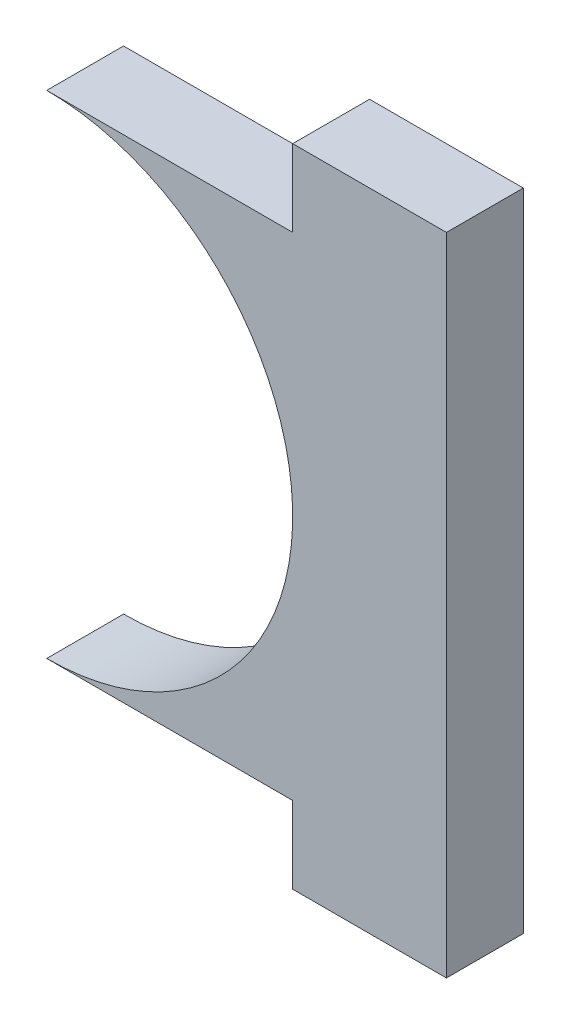
ISO-10303-21;
HEADER;
FILE_DESCRIPTION(('STEP AP214'),'2;1');
FILE_NAME('part.step','',(''),(''),'','','');
FILE_SCHEMA(('AUTOMOTIVE_DESIGN { 1 0 10303 214 1 1 1 1 }'));
ENDSEC;
DATA;
#1=APPLICATION_CONTEXT('core data for automotive mechanical design processes');
#2=APPLICATION_PROTOCOL_DEFINITION('international standard','automotive_design',2000,#1);
#3=PRODUCT_CONTEXT('',#1,'mechanical');
#4=PRODUCT('Part','Part','',(#3));
#5=PRODUCT_RELATED_PRODUCT_CATEGORY('part','',(#4));
#6=PRODUCT_DEFINITION_FORMATION('','',#4);
#7=PRODUCT_DEFINITION_CONTEXT('part definition',#1,'design');
#8=PRODUCT_DEFINITION('design','',#6,#7);
#9=PRODUCT_DEFINITION_SHAPE('','',#8);
#10=(LENGTH_UNIT() NAMED_UNIT(*) SI_UNIT(.MILLI.,.METRE.));
#11=(NAMED_UNIT(*) PLANE_ANGLE_UNIT() SI_UNIT($,.RADIAN.));
#12=(NAMED_UNIT(*) SI_UNIT($,.STERADIAN.) SOLID_ANGLE_UNIT());
#13=UNCERTAINTY_MEASURE_WITH_UNIT(LENGTH_MEASURE(1.E-05),#10,'distance_accuracy_value','');
#14=(GEOMETRIC_REPRESENTATION_CONTEXT(3) GLOBAL_UNCERTAINTY_ASSIGNED_CONTEXT((#13)) GLOBAL_UNIT_ASSIGNED_CONTEXT((#10,
#11,#12)) REPRESENTATION_CONTEXT('',''));
#15=CARTESIAN_POINT('',(0.,0.,0.));
#16=DIRECTION('',(0.,0.,1.));
#17=DIRECTION('',(1.,0.,0.));
#18=AXIS2_PLACEMENT_3D('',#15,#16,#17);
#19=CARTESIAN_POINT('',(26.,-21.,2.5));
#20=DIRECTION('',(0.,1.,0.));
#21=DIRECTION('',(0.,0.,1.));
#22=AXIS2_PLACEMENT_3D('',#19,#20,#21);
#23=PLANE('',#22);
#24=DIRECTION('',(1.,0.,0.));
#25=VECTOR('',#24,1.);
#26=CARTESIAN_POINT('',(26.,-21.,-2.5));
#27=LINE('',#26,#25);
#28=CARTESIAN_POINT('',(16.,-21.,-2.5));
#29=VERTEX_POINT('',#28);
#30=CARTESIAN_POINT('',(26.,-21.,-2.5));
#31=VERTEX_POINT('',#30);
#32=EDGE_CURVE('E135',#29,#31,#27,.T.);
#33=ORIENTED_EDGE('',*,*,#32,.T.);
#34=DIRECTION('',(0.,0.,-1.));
#35=VECTOR('',#34,1.);
#36=CARTESIAN_POINT('',(26.,-21.,2.5));
#37=LINE('',#36,#35);
#38=CARTESIAN_POINT('',(26.,-21.,2.5));
#39=VERTEX_POINT('',#38);
#40=EDGE_CURVE('E11',#39,#31,#37,.T.);
#41=ORIENTED_EDGE('',*,*,#40,.F.);
#42=DIRECTION('',(1.,0.,0.));
#43=VECTOR('',#42,1.);
#44=CARTESIAN_POINT('',(26.,-21.,2.5));
#45=LINE('',#44,#43);
#46=CARTESIAN_POINT('',(16.,-21.,2.5));
#47=VERTEX_POINT('',#46);
#48=EDGE_CURVE('E149',#47,#39,#45,.T.);
#49=ORIENTED_EDGE('',*,*,#48,.F.);
#50=DIRECTION('',(0.,0.,-1.));
#51=VECTOR('',#50,1.);
#52=CARTESIAN_POINT('',(16.,-21.,2.5));
#53=LINE('',#52,#51);
#54=EDGE_CURVE('E131',#47,#29,#53,.T.);
#55=ORIENTED_EDGE('',*,*,#54,.T.);
#56=EDGE_LOOP('',(#33,#41,#49,#55));
#57=FACE_BOUND('',#56,.T.);
#58=ADVANCED_FACE('F39',(#57),#23,.F.);
#59=CARTESIAN_POINT('',(26.,16.,2.5));
#60=DIRECTION('',(-1.,0.,0.));
#61=DIRECTION('',(0.,0.,1.));
#62=AXIS2_PLACEMENT_3D('',#59,#60,#61);
#63=PLANE('',#62);
#64=DIRECTION('',(0.,1.,0.));
#65=VECTOR('',#64,1.);
#66=CARTESIAN_POINT('',(26.,16.,-2.5));
#67=LINE('',#66,#65);
#68=CARTESIAN_POINT('',(26.,21.,-2.5));
#69=VERTEX_POINT('',#68);
#70=EDGE_CURVE('E138',#31,#69,#67,.T.);
#71=ORIENTED_EDGE('',*,*,#70,.T.);
#72=DIRECTION('',(0.,0.,-1.));
#73=VECTOR('',#72,1.);
#74=CARTESIAN_POINT('',(26.,21.,2.5));
#75=LINE('',#74,#73);
#76=CARTESIAN_POINT('',(26.,21.,2.5));
#77=VERTEX_POINT('',#76);
#78=EDGE_CURVE('E47',#77,#69,#75,.T.);
#79=ORIENTED_EDGE('',*,*,#78,.F.);
#80=DIRECTION('',(0.,1.,0.));
#81=VECTOR('',#80,1.);
#82=CARTESIAN_POINT('',(26.,-16.,2.5));
#83=LINE('',#82,#81);
#84=EDGE_CURVE('E98',#39,#77,#83,.T.);
#85=ORIENTED_EDGE('',*,*,#84,.F.);
#86=ORIENTED_EDGE('',*,*,#40,.T.);
#87=EDGE_LOOP('',(#71,#79,#85,#86));
#88=FACE_BOUND('',#87,.T.);
#89=ADVANCED_FACE('F184',(#88),#63,.F.);
#90=CARTESIAN_POINT('',(26.,21.,2.5));
#91=DIRECTION('',(0.,-1.,0.));
#92=DIRECTION('',(0.,0.,-1.));
#93=AXIS2_PLACEMENT_3D('',#90,#91,#92);
#94=PLANE('',#93);
#95=DIRECTION('',(-1.,0.,0.));
#96=VECTOR('',#95,1.);
#97=CARTESIAN_POINT('',(26.,21.,-2.5));
#98=LINE('',#97,#96);
#99=CARTESIAN_POINT('',(16.,21.,-2.5));
#100=VERTEX_POINT('',#99);
#101=EDGE_CURVE('E140',#69,#100,#98,.T.);
#102=ORIENTED_EDGE('',*,*,#101,.T.);
#103=DIRECTION('',(0.,0.,-1.));
#104=VECTOR('',#103,1.);
#105=CARTESIAN_POINT('',(16.,21.,2.5));
#106=LINE('',#105,#104);
#107=CARTESIAN_POINT('',(16.,21.,2.5));
#108=VERTEX_POINT('',#107);
#109=EDGE_CURVE('E156',#108,#100,#106,.T.);
#110=ORIENTED_EDGE('',*,*,#109,.F.);
#111=DIRECTION('',(-1.,0.,0.));
#112=VECTOR('',#111,1.);
#113=CARTESIAN_POINT('',(26.,21.,2.5));
#114=LINE('',#113,#112);
#115=EDGE_CURVE('E164',#77,#108,#114,.T.);
#116=ORIENTED_EDGE('',*,*,#115,.F.);
#117=ORIENTED_EDGE('',*,*,#78,.T.);
#118=EDGE_LOOP('',(#102,#110,#116,#117));
#119=FACE_BOUND('',#118,.T.);
#120=ADVANCED_FACE('F162',(#119),#94,.F.);
#121=CARTESIAN_POINT('',(16.,21.,2.5));
#122=DIRECTION('',(1.,0.,0.));
#123=DIRECTION('',(0.,0.,-1.));
#124=AXIS2_PLACEMENT_3D('',#121,#122,#123);
#125=PLANE('',#124);
#126=DIRECTION('',(0.,-1.,0.));
#127=VECTOR('',#126,1.);
#128=CARTESIAN_POINT('',(16.,21.,-2.5));
#129=LINE('',#128,#127);
#130=CARTESIAN_POINT('',(16.,16.,-2.5));
#131=VERTEX_POINT('',#130);
#132=EDGE_CURVE('E142',#100,#131,#129,.T.);
#133=ORIENTED_EDGE('',*,*,#132,.T.);
#134=DIRECTION('',(0.,0.,-1.));
#135=VECTOR('',#134,1.);
#136=CARTESIAN_POINT('',(16.,16.,2.5));
#137=LINE('',#136,#135);
#138=CARTESIAN_POINT('',(16.,16.,2.5));
#139=VERTEX_POINT('',#138);
#140=EDGE_CURVE('E153',#139,#131,#137,.T.);
#141=ORIENTED_EDGE('',*,*,#140,.F.);
#142=DIRECTION('',(0.,-1.,0.));
#143=VECTOR('',#142,1.);
#144=CARTESIAN_POINT('',(16.,21.,2.5));
#145=LINE('',#144,#143);
#146=EDGE_CURVE('E176',#108,#139,#145,.T.);
#147=ORIENTED_EDGE('',*,*,#146,.F.);
#148=ORIENTED_EDGE('',*,*,#109,.T.);
#149=EDGE_LOOP('',(#133,#141,#147,#148));
#150=FACE_BOUND('',#149,.T.);
#151=ADVANCED_FACE('F172',(#150),#125,.F.);
#152=CARTESIAN_POINT('',(0.,16.,2.5));
#153=DIRECTION('',(0.,-1.,0.));
#154=DIRECTION('',(1.,0.,0.));
#155=AXIS2_PLACEMENT_3D('',#152,#153,#154);
#156=PLANE('',#155);
#157=DIRECTION('',(-1.,0.,0.));
#158=VECTOR('',#157,1.);
#159=CARTESIAN_POINT('',(0.,16.,-2.5));
#160=LINE('',#159,#158);
#161=CARTESIAN_POINT('',(0.,16.,-2.5));
#162=VERTEX_POINT('',#161);
#163=EDGE_CURVE('E144',#131,#162,#160,.T.);
#164=ORIENTED_EDGE('',*,*,#163,.T.);
#165=DIRECTION('',(0.,0.,-1.));
#166=VECTOR('',#165,1.);
#167=CARTESIAN_POINT('',(0.,16.,2.5));
#168=LINE('',#167,#166);
#169=CARTESIAN_POINT('',(0.,16.,2.5));
#170=VERTEX_POINT('',#169);
#171=EDGE_CURVE('E126',#170,#162,#168,.T.);
#172=ORIENTED_EDGE('',*,*,#171,.F.);
#173=DIRECTION('',(-1.,0.,0.));
#174=VECTOR('',#173,1.);
#175=CARTESIAN_POINT('',(0.,16.,2.5));
#176=LINE('',#175,#174);
#177=EDGE_CURVE('E117',#139,#170,#176,.T.);
#178=ORIENTED_EDGE('',*,*,#177,.F.);
#179=ORIENTED_EDGE('',*,*,#140,.T.);
#180=EDGE_LOOP('',(#164,#172,#178,#179));
#181=FACE_BOUND('',#180,.T.);
#182=ADVANCED_FACE('F175',(#181),#156,.F.);
#183=CARTESIAN_POINT('',(0.,0.,2.5));
#184=DIRECTION('',(0.,0.,-1.));
#185=DIRECTION('',(-1.,0.,0.));
#186=AXIS2_PLACEMENT_3D('',#183,#184,#185);
#187=CYLINDRICAL_SURFACE('',#186,16.);
#188=CARTESIAN_POINT('',(0.,0.,-2.5));
#189=DIRECTION('',(0.,0.,-1.));
#190=DIRECTION('',(1.,0.,0.));
#191=AXIS2_PLACEMENT_3D('',#188,#189,#190);
#192=CIRCLE('',#191,16.);
#193=CARTESIAN_POINT('',(0.,-16.,-2.5));
#194=VERTEX_POINT('',#193);
#195=EDGE_CURVE('E125',#162,#194,#192,.T.);
#196=ORIENTED_EDGE('',*,*,#195,.T.);
#197=DIRECTION('',(0.,0.,-1.));
#198=VECTOR('',#197,1.);
#199=CARTESIAN_POINT('',(0.,-16.,2.5));
#200=LINE('',#199,#198);
#201=CARTESIAN_POINT('',(0.,-16.,2.5));
#202=VERTEX_POINT('',#201);
#203=EDGE_CURVE('E122',#202,#194,#200,.T.);
#204=ORIENTED_EDGE('',*,*,#203,.F.);
#205=CARTESIAN_POINT('',(0.,0.,2.5));
#206=DIRECTION('',(0.,0.,-1.));
#207=DIRECTION('',(1.,0.,0.));
#208=AXIS2_PLACEMENT_3D('',#205,#206,#207);
#209=CIRCLE('',#208,16.);
#210=EDGE_CURVE('E111',#170,#202,#209,.T.);
#211=ORIENTED_EDGE('',*,*,#210,.F.);
#212=ORIENTED_EDGE('',*,*,#171,.T.);
#213=EDGE_LOOP('',(#196,#204,#211,#212));
#214=FACE_BOUND('',#213,.T.);
#215=ADVANCED_FACE('F123',(#214),#187,.F.);
#216=CARTESIAN_POINT('',(16.,-16.,2.5));
#217=DIRECTION('',(0.,1.,0.));
#218=DIRECTION('',(-1.,0.,0.));
#219=AXIS2_PLACEMENT_3D('',#216,#217,#218);
#220=PLANE('',#219);
#221=DIRECTION('',(1.,0.,0.));
#222=VECTOR('',#221,1.);
#223=CARTESIAN_POINT('',(16.,-16.,-2.5));
#224=LINE('',#223,#222);
#225=CARTESIAN_POINT('',(16.,-16.,-2.5));
#226=VERTEX_POINT('',#225);
#227=EDGE_CURVE('E84',#194,#226,#224,.T.);
#228=ORIENTED_EDGE('',*,*,#227,.T.);
#229=DIRECTION('',(0.,0.,-1.));
#230=VECTOR('',#229,1.);
#231=CARTESIAN_POINT('',(16.,-16.,2.5));
#232=LINE('',#231,#230);
#233=CARTESIAN_POINT('',(16.,-16.,2.5));
#234=VERTEX_POINT('',#233);
#235=EDGE_CURVE('E127',#234,#226,#232,.T.);
#236=ORIENTED_EDGE('',*,*,#235,.F.);
#237=DIRECTION('',(1.,0.,0.));
#238=VECTOR('',#237,1.);
#239=CARTESIAN_POINT('',(16.,-16.,2.5));
#240=LINE('',#239,#238);
#241=EDGE_CURVE('E115',#202,#234,#240,.T.);
#242=ORIENTED_EDGE('',*,*,#241,.F.);
#243=ORIENTED_EDGE('',*,*,#203,.T.);
#244=EDGE_LOOP('',(#228,#236,#242,#243));
#245=FACE_BOUND('',#244,.T.);
#246=ADVANCED_FACE('F129',(#245),#220,.F.);
#247=CARTESIAN_POINT('',(16.,-21.,2.5));
#248=DIRECTION('',(1.,0.,0.));
#249=DIRECTION('',(0.,0.,-1.));
#250=AXIS2_PLACEMENT_3D('',#247,#248,#249);
#251=PLANE('',#250);
#252=DIRECTION('',(0.,-1.,0.));
#253=VECTOR('',#252,1.);
#254=CARTESIAN_POINT('',(16.,-21.,-2.5));
#255=LINE('',#254,#253);
#256=EDGE_CURVE('E90',#226,#29,#255,.T.);
#257=ORIENTED_EDGE('',*,*,#256,.T.);
#258=ORIENTED_EDGE('',*,*,#54,.F.);
#259=DIRECTION('',(0.,-1.,0.));
#260=VECTOR('',#259,1.);
#261=CARTESIAN_POINT('',(16.,-21.,2.5));
#262=LINE('',#261,#260);
#263=EDGE_CURVE('E55',#234,#47,#262,.T.);
#264=ORIENTED_EDGE('',*,*,#263,.F.);
#265=ORIENTED_EDGE('',*,*,#235,.T.);
#266=EDGE_LOOP('',(#257,#258,#264,#265));
#267=FACE_BOUND('',#266,.T.);
#268=ADVANCED_FACE('F200',(#267),#251,.F.);
#269=CARTESIAN_POINT('',(0.,0.,2.5));
#270=DIRECTION('',(0.,0.,1.));
#271=DIRECTION('',(1.,0.,0.));
#272=AXIS2_PLACEMENT_3D('',#269,#270,#271);
#273=PLANE('',#272);
#274=ORIENTED_EDGE('',*,*,#48,.T.);
#275=ORIENTED_EDGE('',*,*,#84,.T.);
#276=ORIENTED_EDGE('',*,*,#115,.T.);
#277=ORIENTED_EDGE('',*,*,#146,.T.);
#278=ORIENTED_EDGE('',*,*,#177,.T.);
#279=ORIENTED_EDGE('',*,*,#210,.T.);
#280=ORIENTED_EDGE('',*,*,#241,.T.);
#281=ORIENTED_EDGE('',*,*,#263,.T.);
#282=EDGE_LOOP('',(#274,#275,#276,#277,#278,#279,#280,#281));
#283=FACE_BOUND('',#282,.T.);
#284=ADVANCED_FACE('F113',(#283),#273,.T.);
#285=CARTESIAN_POINT('',(0.,0.,-2.5));
#286=DIRECTION('',(0.,0.,1.));
#287=DIRECTION('',(1.,0.,0.));
#288=AXIS2_PLACEMENT_3D('',#285,#286,#287);
#289=PLANE('',#288);
#290=ORIENTED_EDGE('',*,*,#32,.F.);
#291=ORIENTED_EDGE('',*,*,#256,.F.);
#292=ORIENTED_EDGE('',*,*,#227,.F.);
#293=ORIENTED_EDGE('',*,*,#195,.F.);
#294=ORIENTED_EDGE('',*,*,#163,.F.);
#295=ORIENTED_EDGE('',*,*,#132,.F.);
#296=ORIENTED_EDGE('',*,*,#101,.F.);
#297=ORIENTED_EDGE('',*,*,#70,.F.);
#298=EDGE_LOOP('',(#290,#291,#292,#293,#294,#295,#296,#297));
#299=FACE_BOUND('',#298,.T.);
#300=ADVANCED_FACE('F168',(#299),#289,.F.);
#301=CLOSED_SHELL('',(#58,#89,#120,#151,#182,#215,#246,#268,#284,#300));
#302=MANIFOLD_SOLID_BREP('B2',#301);
#303=ADVANCED_BREP_SHAPE_REPRESENTATION('',(#18,#302),#14);
#304=SHAPE_DEFINITION_REPRESENTATION(#9,#303);
ENDSEC;
END-ISO-10303-21;
